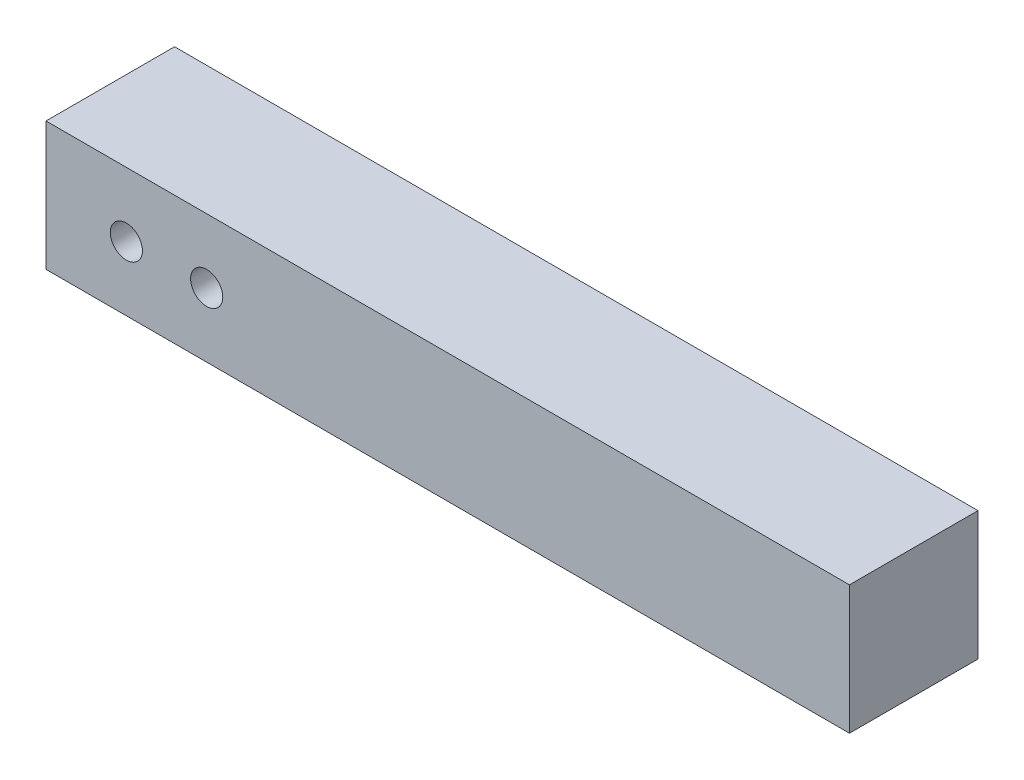
ISO-10303-21;
HEADER;
FILE_DESCRIPTION(('STEP AP214'),'2;1');
FILE_NAME('part.step','',(''),(''),'','','');
FILE_SCHEMA(('AUTOMOTIVE_DESIGN { 1 0 10303 214 1 1 1 1 }'));
ENDSEC;
DATA;
#1=APPLICATION_CONTEXT('core data for automotive mechanical design processes');
#2=APPLICATION_PROTOCOL_DEFINITION('international standard','automotive_design',2000,#1);
#3=PRODUCT_CONTEXT('',#1,'mechanical');
#4=PRODUCT('Part','Part','',(#3));
#5=PRODUCT_RELATED_PRODUCT_CATEGORY('part','',(#4));
#6=PRODUCT_DEFINITION_FORMATION('','',#4);
#7=PRODUCT_DEFINITION_CONTEXT('part definition',#1,'design');
#8=PRODUCT_DEFINITION('design','',#6,#7);
#9=PRODUCT_DEFINITION_SHAPE('','',#8);
#10=(LENGTH_UNIT() NAMED_UNIT(*) SI_UNIT(.MILLI.,.METRE.));
#11=(NAMED_UNIT(*) PLANE_ANGLE_UNIT() SI_UNIT($,.RADIAN.));
#12=(NAMED_UNIT(*) SI_UNIT($,.STERADIAN.) SOLID_ANGLE_UNIT());
#13=UNCERTAINTY_MEASURE_WITH_UNIT(LENGTH_MEASURE(1.E-05),#10,'distance_accuracy_value','');
#14=(GEOMETRIC_REPRESENTATION_CONTEXT(3) GLOBAL_UNCERTAINTY_ASSIGNED_CONTEXT((#13)) GLOBAL_UNIT_ASSIGNED_CONTEXT((#10,
#11,#12)) REPRESENTATION_CONTEXT('',''));
#15=CARTESIAN_POINT('',(0.,0.,0.));
#16=DIRECTION('',(0.,0.,1.));
#17=DIRECTION('',(1.,0.,0.));
#18=AXIS2_PLACEMENT_3D('',#15,#16,#17);
#19=CARTESIAN_POINT('',(0.,-40.,40.));
#20=DIRECTION('',(0.,0.,1.));
#21=DIRECTION('',(1.,0.,0.));
#22=AXIS2_PLACEMENT_3D('',#19,#20,#21);
#23=PLANE('',#22);
#24=CARTESIAN_POINT('',(25.,-20.,40.));
#25=DIRECTION('',(0.,0.,1.));
#26=DIRECTION('',(1.,0.,0.));
#27=AXIS2_PLACEMENT_3D('',#24,#25,#26);
#28=CIRCLE('',#27,5.);
#29=CARTESIAN_POINT('',(30.,-20.,40.));
#30=VERTEX_POINT('',#29);
#31=EDGE_CURVE('E108',#30,#30,#28,.T.);
#32=ORIENTED_EDGE('',*,*,#31,.F.);
#33=EDGE_LOOP('',(#32));
#34=FACE_BOUND('',#33,.T.);
#35=DIRECTION('',(0.,-1.,0.));
#36=VECTOR('',#35,1.);
#37=CARTESIAN_POINT('',(0.,0.,40.));
#38=LINE('',#37,#36);
#39=CARTESIAN_POINT('',(0.,0.,40.));
#40=VERTEX_POINT('',#39);
#41=CARTESIAN_POINT('',(0.,-40.,40.));
#42=VERTEX_POINT('',#41);
#43=EDGE_CURVE('E93',#40,#42,#38,.T.);
#44=ORIENTED_EDGE('',*,*,#43,.T.);
#45=DIRECTION('',(1.,0.,0.));
#46=VECTOR('',#45,1.);
#47=CARTESIAN_POINT('',(0.,-40.,40.));
#48=LINE('',#47,#46);
#49=CARTESIAN_POINT('',(250.,-40.,40.));
#50=VERTEX_POINT('',#49);
#51=EDGE_CURVE('E88',#42,#50,#48,.T.);
#52=ORIENTED_EDGE('',*,*,#51,.T.);
#53=DIRECTION('',(0.,1.,0.));
#54=VECTOR('',#53,1.);
#55=CARTESIAN_POINT('',(250.,0.,40.));
#56=LINE('',#55,#54);
#57=CARTESIAN_POINT('',(250.,0.,40.));
#58=VERTEX_POINT('',#57);
#59=EDGE_CURVE('E91',#50,#58,#56,.T.);
#60=ORIENTED_EDGE('',*,*,#59,.T.);
#61=DIRECTION('',(-1.,0.,0.));
#62=VECTOR('',#61,1.);
#63=CARTESIAN_POINT('',(0.,0.,40.));
#64=LINE('',#63,#62);
#65=EDGE_CURVE('E58',#58,#40,#64,.T.);
#66=ORIENTED_EDGE('',*,*,#65,.T.);
#67=EDGE_LOOP('',(#44,#52,#60,#66));
#68=FACE_BOUND('',#67,.T.);
#69=CARTESIAN_POINT('',(50.,-20.,40.));
#70=DIRECTION('',(0.,0.,1.));
#71=DIRECTION('',(1.,0.,0.));
#72=AXIS2_PLACEMENT_3D('',#69,#70,#71);
#73=CIRCLE('',#72,4.99999999999999);
#74=CARTESIAN_POINT('',(55.,-20.,40.));
#75=VERTEX_POINT('',#74);
#76=EDGE_CURVE('E123',#75,#75,#73,.T.);
#77=ORIENTED_EDGE('',*,*,#76,.F.);
#78=EDGE_LOOP('',(#77));
#79=FACE_BOUND('',#78,.T.);
#80=ADVANCED_FACE('F41',(#34,#68,#79),#23,.T.);
#81=CARTESIAN_POINT('',(0.,-40.,0.));
#82=DIRECTION('',(0.,0.,1.));
#83=DIRECTION('',(1.,0.,0.));
#84=AXIS2_PLACEMENT_3D('',#81,#82,#83);
#85=PLANE('',#84);
#86=DIRECTION('',(0.,-1.,0.));
#87=VECTOR('',#86,1.);
#88=CARTESIAN_POINT('',(0.,0.,0.));
#89=LINE('',#88,#87);
#90=CARTESIAN_POINT('',(0.,0.,0.));
#91=VERTEX_POINT('',#90);
#92=CARTESIAN_POINT('',(0.,-40.,0.));
#93=VERTEX_POINT('',#92);
#94=EDGE_CURVE('E105',#91,#93,#89,.T.);
#95=ORIENTED_EDGE('',*,*,#94,.F.);
#96=DIRECTION('',(-1.,0.,0.));
#97=VECTOR('',#96,1.);
#98=CARTESIAN_POINT('',(0.,0.,0.));
#99=LINE('',#98,#97);
#100=CARTESIAN_POINT('',(250.,0.,0.));
#101=VERTEX_POINT('',#100);
#102=EDGE_CURVE('E81',#101,#91,#99,.T.);
#103=ORIENTED_EDGE('',*,*,#102,.F.);
#104=DIRECTION('',(0.,1.,0.));
#105=VECTOR('',#104,1.);
#106=CARTESIAN_POINT('',(250.,0.,0.));
#107=LINE('',#106,#105);
#108=CARTESIAN_POINT('',(250.,-40.,0.));
#109=VERTEX_POINT('',#108);
#110=EDGE_CURVE('E75',#109,#101,#107,.T.);
#111=ORIENTED_EDGE('',*,*,#110,.F.);
#112=DIRECTION('',(1.,0.,0.));
#113=VECTOR('',#112,1.);
#114=CARTESIAN_POINT('',(0.,-40.,0.));
#115=LINE('',#114,#113);
#116=EDGE_CURVE('E97',#93,#109,#115,.T.);
#117=ORIENTED_EDGE('',*,*,#116,.F.);
#118=EDGE_LOOP('',(#95,#103,#111,#117));
#119=FACE_BOUND('',#118,.T.);
#120=CARTESIAN_POINT('',(25.,-20.,0.));
#121=DIRECTION('',(0.,0.,1.));
#122=DIRECTION('',(1.,0.,0.));
#123=AXIS2_PLACEMENT_3D('',#120,#121,#122);
#124=CIRCLE('',#123,5.);
#125=CARTESIAN_POINT('',(30.,-20.,0.));
#126=VERTEX_POINT('',#125);
#127=EDGE_CURVE('E120',#126,#126,#124,.T.);
#128=ORIENTED_EDGE('',*,*,#127,.T.);
#129=EDGE_LOOP('',(#128));
#130=FACE_BOUND('',#129,.T.);
#131=CARTESIAN_POINT('',(50.,-20.,0.));
#132=DIRECTION('',(0.,0.,1.));
#133=DIRECTION('',(1.,0.,0.));
#134=AXIS2_PLACEMENT_3D('',#131,#132,#133);
#135=CIRCLE('',#134,4.99999999999999);
#136=CARTESIAN_POINT('',(55.,-20.,0.));
#137=VERTEX_POINT('',#136);
#138=EDGE_CURVE('E126',#137,#137,#135,.T.);
#139=ORIENTED_EDGE('',*,*,#138,.T.);
#140=EDGE_LOOP('',(#139));
#141=FACE_BOUND('',#140,.T.);
#142=ADVANCED_FACE('F116',(#119,#130,#141),#85,.F.);
#143=CARTESIAN_POINT('',(0.,0.,40.));
#144=DIRECTION('',(1.,0.,0.));
#145=DIRECTION('',(0.,1.,0.));
#146=AXIS2_PLACEMENT_3D('',#143,#144,#145);
#147=PLANE('',#146);
#148=ORIENTED_EDGE('',*,*,#94,.T.);
#149=DIRECTION('',(0.,0.,-1.));
#150=VECTOR('',#149,1.);
#151=CARTESIAN_POINT('',(0.,-40.,40.));
#152=LINE('',#151,#150);
#153=EDGE_CURVE('E11',#42,#93,#152,.T.);
#154=ORIENTED_EDGE('',*,*,#153,.F.);
#155=ORIENTED_EDGE('',*,*,#43,.F.);
#156=DIRECTION('',(0.,0.,-1.));
#157=VECTOR('',#156,1.);
#158=CARTESIAN_POINT('',(0.,0.,40.));
#159=LINE('',#158,#157);
#160=EDGE_CURVE('E101',#40,#91,#159,.T.);
#161=ORIENTED_EDGE('',*,*,#160,.T.);
#162=EDGE_LOOP('',(#148,#154,#155,#161));
#163=FACE_BOUND('',#162,.T.);
#164=ADVANCED_FACE('F43',(#163),#147,.F.);
#165=CARTESIAN_POINT('',(0.,-40.,40.));
#166=DIRECTION('',(0.,1.,0.));
#167=DIRECTION('',(0.,0.,1.));
#168=AXIS2_PLACEMENT_3D('',#165,#166,#167);
#169=PLANE('',#168);
#170=ORIENTED_EDGE('',*,*,#116,.T.);
#171=DIRECTION('',(0.,0.,-1.));
#172=VECTOR('',#171,1.);
#173=CARTESIAN_POINT('',(250.,-40.,40.));
#174=LINE('',#173,#172);
#175=EDGE_CURVE('E50',#50,#109,#174,.T.);
#176=ORIENTED_EDGE('',*,*,#175,.F.);
#177=ORIENTED_EDGE('',*,*,#51,.F.);
#178=ORIENTED_EDGE('',*,*,#153,.T.);
#179=EDGE_LOOP('',(#170,#176,#177,#178));
#180=FACE_BOUND('',#179,.T.);
#181=ADVANCED_FACE('F96',(#180),#169,.F.);
#182=CARTESIAN_POINT('',(250.,0.,40.));
#183=DIRECTION('',(-1.,0.,0.));
#184=DIRECTION('',(0.,0.,1.));
#185=AXIS2_PLACEMENT_3D('',#182,#183,#184);
#186=PLANE('',#185);
#187=ORIENTED_EDGE('',*,*,#110,.T.);
#188=DIRECTION('',(0.,0.,-1.));
#189=VECTOR('',#188,1.);
#190=CARTESIAN_POINT('',(250.,0.,40.));
#191=LINE('',#190,#189);
#192=EDGE_CURVE('E98',#58,#101,#191,.T.);
#193=ORIENTED_EDGE('',*,*,#192,.F.);
#194=ORIENTED_EDGE('',*,*,#59,.F.);
#195=ORIENTED_EDGE('',*,*,#175,.T.);
#196=EDGE_LOOP('',(#187,#193,#194,#195));
#197=FACE_BOUND('',#196,.T.);
#198=ADVANCED_FACE('F99',(#197),#186,.F.);
#199=CARTESIAN_POINT('',(0.,0.,40.));
#200=DIRECTION('',(0.,-1.,0.));
#201=DIRECTION('',(0.,0.,-1.));
#202=AXIS2_PLACEMENT_3D('',#199,#200,#201);
#203=PLANE('',#202);
#204=ORIENTED_EDGE('',*,*,#102,.T.);
#205=ORIENTED_EDGE('',*,*,#160,.F.);
#206=ORIENTED_EDGE('',*,*,#65,.F.);
#207=ORIENTED_EDGE('',*,*,#192,.T.);
#208=EDGE_LOOP('',(#204,#205,#206,#207));
#209=FACE_BOUND('',#208,.T.);
#210=ADVANCED_FACE('F113',(#209),#203,.F.);
#211=CARTESIAN_POINT('',(25.,-20.,40.));
#212=DIRECTION('',(0.,0.,-1.));
#213=DIRECTION('',(-1.,0.,0.));
#214=AXIS2_PLACEMENT_3D('',#211,#212,#213);
#215=CYLINDRICAL_SURFACE('',#214,5.);
#216=ORIENTED_EDGE('',*,*,#31,.T.);
#217=EDGE_LOOP('',(#216));
#218=FACE_BOUND('',#217,.T.);
#219=ORIENTED_EDGE('',*,*,#127,.F.);
#220=EDGE_LOOP('',(#219));
#221=FACE_BOUND('',#220,.T.);
#222=ADVANCED_FACE('F143',(#218,#221),#215,.F.);
#223=CARTESIAN_POINT('',(50.,-20.,40.));
#224=DIRECTION('',(0.,0.,-1.));
#225=DIRECTION('',(-1.,0.,0.));
#226=AXIS2_PLACEMENT_3D('',#223,#224,#225);
#227=CYLINDRICAL_SURFACE('',#226,4.99999999999999);
#228=ORIENTED_EDGE('',*,*,#76,.T.);
#229=EDGE_LOOP('',(#228));
#230=FACE_BOUND('',#229,.T.);
#231=ORIENTED_EDGE('',*,*,#138,.F.);
#232=EDGE_LOOP('',(#231));
#233=FACE_BOUND('',#232,.T.);
#234=ADVANCED_FACE('F132',(#230,#233),#227,.F.);
#235=CLOSED_SHELL('',(#80,#142,#164,#181,#198,#210,#222,#234));
#236=MANIFOLD_SOLID_BREP('B2',#235);
#237=ADVANCED_BREP_SHAPE_REPRESENTATION('',(#18,#236),#14);
#238=SHAPE_DEFINITION_REPRESENTATION(#9,#237);
ENDSEC;
END-ISO-10303-21;
